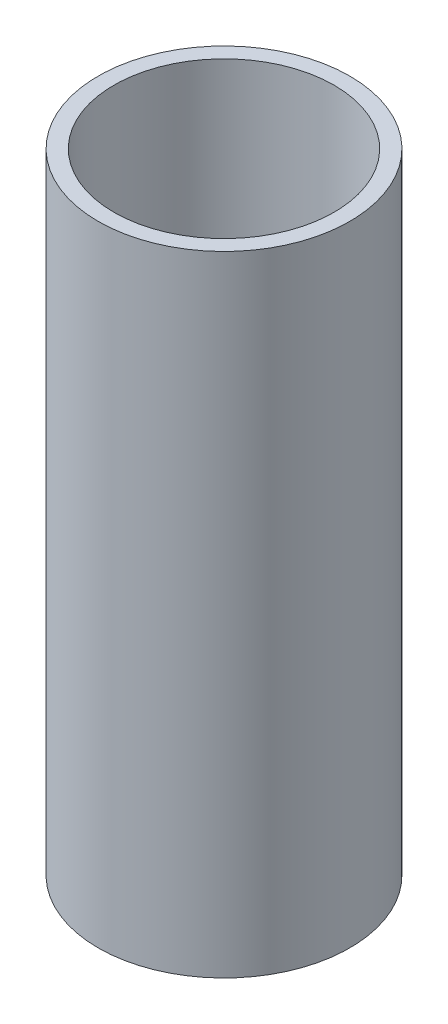
ISO-10303-21;
HEADER;
FILE_DESCRIPTION(('STEP AP214'),'2;1');
FILE_NAME('part.step','',(''),(''),'','','');
FILE_SCHEMA(('AUTOMOTIVE_DESIGN { 1 0 10303 214 1 1 1 1 }'));
ENDSEC;
DATA;
#1=APPLICATION_CONTEXT('core data for automotive mechanical design processes');
#2=APPLICATION_PROTOCOL_DEFINITION('international standard','automotive_design',2000,#1);
#3=PRODUCT_CONTEXT('',#1,'mechanical');
#4=PRODUCT('Part','Part','',(#3));
#5=PRODUCT_RELATED_PRODUCT_CATEGORY('part','',(#4));
#6=PRODUCT_DEFINITION_FORMATION('','',#4);
#7=PRODUCT_DEFINITION_CONTEXT('part definition',#1,'design');
#8=PRODUCT_DEFINITION('design','',#6,#7);
#9=PRODUCT_DEFINITION_SHAPE('','',#8);
#10=(LENGTH_UNIT() NAMED_UNIT(*) SI_UNIT(.MILLI.,.METRE.));
#11=(NAMED_UNIT(*) PLANE_ANGLE_UNIT() SI_UNIT($,.RADIAN.));
#12=(NAMED_UNIT(*) SI_UNIT($,.STERADIAN.) SOLID_ANGLE_UNIT());
#13=UNCERTAINTY_MEASURE_WITH_UNIT(LENGTH_MEASURE(1.E-05),#10,'distance_accuracy_value','');
#14=(GEOMETRIC_REPRESENTATION_CONTEXT(3) GLOBAL_UNCERTAINTY_ASSIGNED_CONTEXT((#13)) GLOBAL_UNIT_ASSIGNED_CONTEXT((#10,
#11,#12)) REPRESENTATION_CONTEXT('',''));
#15=CARTESIAN_POINT('',(0.,0.,0.));
#16=DIRECTION('',(0.,0.,1.));
#17=DIRECTION('',(1.,0.,0.));
#18=AXIS2_PLACEMENT_3D('',#15,#16,#17);
#19=CARTESIAN_POINT('',(0.,80.,0.));
#20=DIRECTION('',(0.,1.,0.));
#21=DIRECTION('',(0.,0.,1.));
#22=AXIS2_PLACEMENT_3D('',#19,#20,#21);
#23=PLANE('',#22);
#24=CARTESIAN_POINT('',(0.,80.,0.));
#25=DIRECTION('',(0.,1.,0.));
#26=DIRECTION('',(0.,0.,1.));
#27=AXIS2_PLACEMENT_3D('',#24,#25,#26);
#28=CIRCLE('',#27,16.);
#29=CARTESIAN_POINT('',(0.,80.,16.));
#30=VERTEX_POINT('',#29);
#31=EDGE_CURVE('E10',#30,#30,#28,.T.);
#32=ORIENTED_EDGE('',*,*,#31,.T.);
#33=EDGE_LOOP('',(#32));
#34=FACE_BOUND('',#33,.T.);
#35=CARTESIAN_POINT('',(0.,80.,0.));
#36=DIRECTION('',(0.,1.,0.));
#37=DIRECTION('',(0.,0.,1.));
#38=AXIS2_PLACEMENT_3D('',#35,#36,#37);
#39=CIRCLE('',#38,14.);
#40=CARTESIAN_POINT('',(0.,80.,14.));
#41=VERTEX_POINT('',#40);
#42=EDGE_CURVE('E42',#41,#41,#39,.T.);
#43=ORIENTED_EDGE('',*,*,#42,.F.);
#44=EDGE_LOOP('',(#43));
#45=FACE_BOUND('',#44,.T.);
#46=ADVANCED_FACE('F31',(#34,#45),#23,.T.);
#47=CARTESIAN_POINT('',(0.,0.,0.));
#48=DIRECTION('',(0.,1.,0.));
#49=DIRECTION('',(0.,0.,1.));
#50=AXIS2_PLACEMENT_3D('',#47,#48,#49);
#51=PLANE('',#50);
#52=CARTESIAN_POINT('',(0.,0.,0.));
#53=DIRECTION('',(0.,1.,0.));
#54=DIRECTION('',(0.,0.,1.));
#55=AXIS2_PLACEMENT_3D('',#52,#53,#54);
#56=CIRCLE('',#55,16.);
#57=CARTESIAN_POINT('',(0.,0.,16.));
#58=VERTEX_POINT('',#57);
#59=EDGE_CURVE('E35',#58,#58,#56,.T.);
#60=ORIENTED_EDGE('',*,*,#59,.F.);
#61=EDGE_LOOP('',(#60));
#62=FACE_BOUND('',#61,.T.);
#63=CARTESIAN_POINT('',(0.,0.,0.));
#64=DIRECTION('',(0.,1.,0.));
#65=DIRECTION('',(0.,0.,1.));
#66=AXIS2_PLACEMENT_3D('',#63,#64,#65);
#67=CIRCLE('',#66,14.);
#68=CARTESIAN_POINT('',(0.,0.,14.));
#69=VERTEX_POINT('',#68);
#70=EDGE_CURVE('E44',#69,#69,#67,.T.);
#71=ORIENTED_EDGE('',*,*,#70,.T.);
#72=EDGE_LOOP('',(#71));
#73=FACE_BOUND('',#72,.T.);
#74=ADVANCED_FACE('F54',(#62,#73),#51,.F.);
#75=CARTESIAN_POINT('',(0.,80.,0.));
#76=DIRECTION('',(0.,-1.,0.));
#77=DIRECTION('',(0.,0.,-1.));
#78=AXIS2_PLACEMENT_3D('',#75,#76,#77);
#79=CYLINDRICAL_SURFACE('',#78,16.);
#80=ORIENTED_EDGE('',*,*,#31,.F.);
#81=EDGE_LOOP('',(#80));
#82=FACE_BOUND('',#81,.T.);
#83=ORIENTED_EDGE('',*,*,#59,.T.);
#84=EDGE_LOOP('',(#83));
#85=FACE_BOUND('',#84,.T.);
#86=ADVANCED_FACE('F33',(#82,#85),#79,.T.);
#87=CARTESIAN_POINT('',(0.,80.,0.));
#88=DIRECTION('',(0.,-1.,0.));
#89=DIRECTION('',(0.,0.,-1.));
#90=AXIS2_PLACEMENT_3D('',#87,#88,#89);
#91=CYLINDRICAL_SURFACE('',#90,14.);
#92=ORIENTED_EDGE('',*,*,#42,.T.);
#93=EDGE_LOOP('',(#92));
#94=FACE_BOUND('',#93,.T.);
#95=ORIENTED_EDGE('',*,*,#70,.F.);
#96=EDGE_LOOP('',(#95));
#97=FACE_BOUND('',#96,.T.);
#98=ADVANCED_FACE('F50',(#94,#97),#91,.F.);
#99=CLOSED_SHELL('',(#46,#74,#86,#98));
#100=MANIFOLD_SOLID_BREP('B2',#99);
#101=ADVANCED_BREP_SHAPE_REPRESENTATION('',(#18,#100),#14);
#102=SHAPE_DEFINITION_REPRESENTATION(#9,#101);
ENDSEC;
END-ISO-10303-21;
